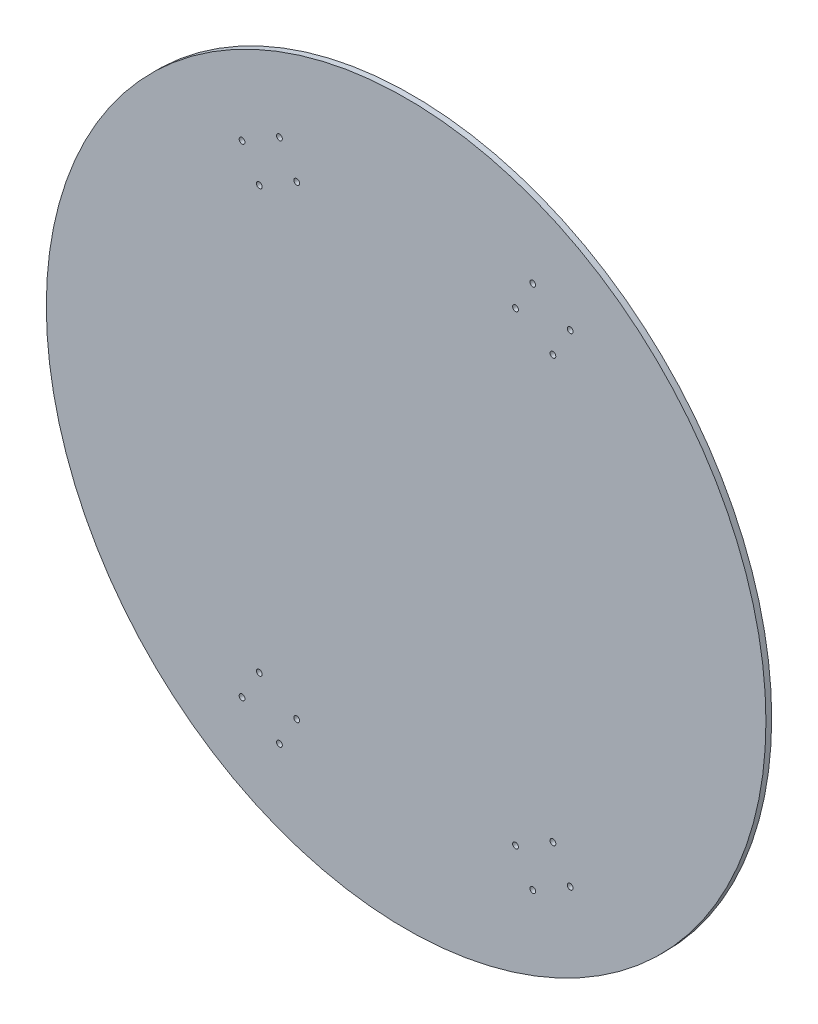
ISO-10303-21;
HEADER;
FILE_DESCRIPTION(('STEP AP214'),'2;1');
FILE_NAME('part.step','',(''),(''),'','','');
FILE_SCHEMA(('AUTOMOTIVE_DESIGN { 1 0 10303 214 1 1 1 1 }'));
ENDSEC;
DATA;
#1=APPLICATION_CONTEXT('core data for automotive mechanical design processes');
#2=APPLICATION_PROTOCOL_DEFINITION('international standard','automotive_design',2000,#1);
#3=PRODUCT_CONTEXT('',#1,'mechanical');
#4=PRODUCT('Part','Part','',(#3));
#5=PRODUCT_RELATED_PRODUCT_CATEGORY('part','',(#4));
#6=PRODUCT_DEFINITION_FORMATION('','',#4);
#7=PRODUCT_DEFINITION_CONTEXT('part definition',#1,'design');
#8=PRODUCT_DEFINITION('design','',#6,#7);
#9=PRODUCT_DEFINITION_SHAPE('','',#8);
#10=(LENGTH_UNIT() NAMED_UNIT(*) SI_UNIT(.MILLI.,.METRE.));
#11=(NAMED_UNIT(*) PLANE_ANGLE_UNIT() SI_UNIT($,.RADIAN.));
#12=(NAMED_UNIT(*) SI_UNIT($,.STERADIAN.) SOLID_ANGLE_UNIT());
#13=UNCERTAINTY_MEASURE_WITH_UNIT(LENGTH_MEASURE(1.E-05),#10,'distance_accuracy_value','');
#14=(GEOMETRIC_REPRESENTATION_CONTEXT(3) GLOBAL_UNCERTAINTY_ASSIGNED_CONTEXT((#13)) GLOBAL_UNIT_ASSIGNED_CONTEXT((#10,
#11,#12)) REPRESENTATION_CONTEXT('',''));
#15=CARTESIAN_POINT('',(0.,0.,0.));
#16=DIRECTION('',(0.,0.,1.));
#17=DIRECTION('',(1.,0.,0.));
#18=AXIS2_PLACEMENT_3D('',#15,#16,#17);
#19=CARTESIAN_POINT('',(0.,0.,4.));
#20=DIRECTION('',(0.,0.,-1.));
#21=DIRECTION('',(-1.,0.,0.));
#22=AXIS2_PLACEMENT_3D('',#19,#20,#21);
#23=CYLINDRICAL_SURFACE('',#22,250.);
#24=CARTESIAN_POINT('',(0.,0.,4.));
#25=DIRECTION('',(0.,0.,1.));
#26=DIRECTION('',(1.,0.,0.));
#27=AXIS2_PLACEMENT_3D('',#24,#25,#26);
#28=CIRCLE('',#27,250.);
#29=CARTESIAN_POINT('',(250.,0.,4.));
#30=VERTEX_POINT('',#29);
#31=EDGE_CURVE('E10',#30,#30,#28,.T.);
#32=ORIENTED_EDGE('',*,*,#31,.F.);
#33=EDGE_LOOP('',(#32));
#34=FACE_BOUND('',#33,.T.);
#35=CARTESIAN_POINT('',(0.,0.,0.));
#36=DIRECTION('',(0.,0.,1.));
#37=DIRECTION('',(1.,0.,0.));
#38=AXIS2_PLACEMENT_3D('',#35,#36,#37);
#39=CIRCLE('',#38,250.);
#40=CARTESIAN_POINT('',(250.,0.,0.));
#41=VERTEX_POINT('',#40);
#42=EDGE_CURVE('E50',#41,#41,#39,.T.);
#43=ORIENTED_EDGE('',*,*,#42,.T.);
#44=EDGE_LOOP('',(#43));
#45=FACE_BOUND('',#44,.T.);
#46=ADVANCED_FACE('F42',(#34,#45),#23,.T.);
#47=CARTESIAN_POINT('',(0.,0.,4.));
#48=DIRECTION('',(0.,0.,1.));
#49=DIRECTION('',(1.,0.,0.));
#50=AXIS2_PLACEMENT_3D('',#47,#48,#49);
#51=PLANE('',#50);
#52=CARTESIAN_POINT('',(101.990381056757,-146.652521873631,4.));
#53=DIRECTION('',(0.,0.,1.));
#54=DIRECTION('',(1.,0.,0.));
#55=AXIS2_PLACEMENT_3D('',#52,#53,#54);
#56=CIRCLE('',#55,2.00000000000259);
#57=CARTESIAN_POINT('',(103.990381056759,-146.652521873631,4.));
#58=VERTEX_POINT('',#57);
#59=EDGE_CURVE('E284',#58,#58,#56,.T.);
#60=ORIENTED_EDGE('',*,*,#59,.F.);
#61=EDGE_LOOP('',(#60));
#62=FACE_BOUND('',#61,.T.);
#63=CARTESIAN_POINT('',(113.990381056749,167.437131564445,4.));
#64=DIRECTION('',(0.,0.,1.));
#65=DIRECTION('',(1.,0.,0.));
#66=AXIS2_PLACEMENT_3D('',#63,#64,#65);
#67=CIRCLE('',#66,1.99999999998204);
#68=CARTESIAN_POINT('',(115.990381056731,167.437131564445,4.));
#69=VERTEX_POINT('',#68);
#70=EDGE_CURVE('E279',#69,#69,#67,.T.);
#71=ORIENTED_EDGE('',*,*,#70,.F.);
#72=EDGE_LOOP('',(#71));
#73=FACE_BOUND('',#72,.T.);
#74=CARTESIAN_POINT('',(101.990381056757,146.652521873631,4.));
#75=DIRECTION('',(0.,0.,1.));
#76=DIRECTION('',(1.,0.,0.));
#77=AXIS2_PLACEMENT_3D('',#74,#75,#76);
#78=CIRCLE('',#77,1.99999999998647);
#79=CARTESIAN_POINT('',(103.990381056743,146.652521873631,4.));
#80=VERTEX_POINT('',#79);
#81=EDGE_CURVE('E283',#80,#80,#78,.T.);
#82=ORIENTED_EDGE('',*,*,#81,.F.);
#83=EDGE_LOOP('',(#82));
#84=FACE_BOUND('',#83,.T.);
#85=CARTESIAN_POINT('',(88.0096189432318,182.437131564436,4.));
#86=DIRECTION('',(0.,0.,1.));
#87=DIRECTION('',(1.,0.,0.));
#88=AXIS2_PLACEMENT_3D('',#85,#86,#87);
#89=CIRCLE('',#88,1.99999999999894);
#90=CARTESIAN_POINT('',(90.0096189432307,182.437131564436,4.));
#91=VERTEX_POINT('',#90);
#92=EDGE_CURVE('E187',#91,#91,#89,.T.);
#93=ORIENTED_EDGE('',*,*,#92,.F.);
#94=EDGE_LOOP('',(#93));
#95=FACE_BOUND('',#94,.T.);
#96=CARTESIAN_POINT('',(-76.0096189432389,-161.652521873622,4.));
#97=DIRECTION('',(0.,0.,1.));
#98=DIRECTION('',(1.,0.,0.));
#99=AXIS2_PLACEMENT_3D('',#96,#97,#98);
#100=CIRCLE('',#99,2.00000000000216);
#101=CARTESIAN_POINT('',(-74.0096189432367,-161.652521873622,4.));
#102=VERTEX_POINT('',#101);
#103=EDGE_CURVE('E267',#102,#102,#100,.T.);
#104=ORIENTED_EDGE('',*,*,#103,.F.);
#105=EDGE_LOOP('',(#104));
#106=FACE_BOUND('',#105,.T.);
#107=CARTESIAN_POINT('',(88.0096189432317,-182.437131564436,4.));
#108=DIRECTION('',(0.,0.,1.));
#109=DIRECTION('',(1.,0.,0.));
#110=AXIS2_PLACEMENT_3D('',#107,#108,#109);
#111=CIRCLE('',#110,1.99999999998116);
#112=CARTESIAN_POINT('',(90.0096189432129,-182.437131564436,4.));
#113=VERTEX_POINT('',#112);
#114=EDGE_CURVE('E293',#113,#113,#111,.T.);
#115=ORIENTED_EDGE('',*,*,#114,.F.);
#116=EDGE_LOOP('',(#115));
#117=FACE_BOUND('',#116,.T.);
#118=CARTESIAN_POINT('',(76.009618943239,-161.652521873622,4.));
#119=DIRECTION('',(0.,0.,1.));
#120=DIRECTION('',(1.,0.,0.));
#121=AXIS2_PLACEMENT_3D('',#118,#119,#120);
#122=CIRCLE('',#121,1.99999999998571);
#123=CARTESIAN_POINT('',(78.0096189432247,-161.652521873622,4.));
#124=VERTEX_POINT('',#123);
#125=EDGE_CURVE('E297',#124,#124,#122,.T.);
#126=ORIENTED_EDGE('',*,*,#125,.F.);
#127=EDGE_LOOP('',(#126));
#128=FACE_BOUND('',#127,.T.);
#129=CARTESIAN_POINT('',(113.990381056749,-167.437131564445,4.));
#130=DIRECTION('',(0.,0.,1.));
#131=DIRECTION('',(1.,0.,0.));
#132=AXIS2_PLACEMENT_3D('',#129,#130,#131);
#133=CIRCLE('',#132,1.99999999999801);
#134=CARTESIAN_POINT('',(115.990381056747,-167.437131564445,4.));
#135=VERTEX_POINT('',#134);
#136=EDGE_CURVE('E287',#135,#135,#133,.T.);
#137=ORIENTED_EDGE('',*,*,#136,.F.);
#138=EDGE_LOOP('',(#137));
#139=FACE_BOUND('',#138,.T.);
#140=CARTESIAN_POINT('',(-101.990381056757,146.652521873631,4.));
#141=DIRECTION('',(0.,0.,1.));
#142=DIRECTION('',(1.,0.,0.));
#143=AXIS2_PLACEMENT_3D('',#140,#141,#142);
#144=CIRCLE('',#143,2.00000000000382);
#145=CARTESIAN_POINT('',(-99.9903810567528,146.652521873631,4.));
#146=VERTEX_POINT('',#145);
#147=EDGE_CURVE('E254',#146,#146,#144,.T.);
#148=ORIENTED_EDGE('',*,*,#147,.F.);
#149=EDGE_LOOP('',(#148));
#150=FACE_BOUND('',#149,.T.);
#151=CARTESIAN_POINT('',(-113.990381056749,-167.437131564445,4.));
#152=DIRECTION('',(0.,0.,1.));
#153=DIRECTION('',(1.,0.,0.));
#154=AXIS2_PLACEMENT_3D('',#151,#152,#153);
#155=CIRCLE('',#154,1.9999999999807);
#156=CARTESIAN_POINT('',(-111.990381056769,-167.437131564445,4.));
#157=VERTEX_POINT('',#156);
#158=EDGE_CURVE('E250',#157,#157,#155,.T.);
#159=ORIENTED_EDGE('',*,*,#158,.F.);
#160=EDGE_LOOP('',(#159));
#161=FACE_BOUND('',#160,.T.);
#162=CARTESIAN_POINT('',(-101.990381056757,-146.652521873631,4.));
#163=DIRECTION('',(0.,0.,1.));
#164=DIRECTION('',(1.,0.,0.));
#165=AXIS2_PLACEMENT_3D('',#162,#163,#164);
#166=CIRCLE('',#165,1.99999999998531);
#167=CARTESIAN_POINT('',(-99.9903810567713,-146.652521873631,4.));
#168=VERTEX_POINT('',#167);
#169=EDGE_CURVE('E253',#168,#168,#166,.T.);
#170=ORIENTED_EDGE('',*,*,#169,.F.);
#171=EDGE_LOOP('',(#170));
#172=FACE_BOUND('',#171,.T.);
#173=CARTESIAN_POINT('',(-88.0096189432317,-182.437131564436,4.));
#174=DIRECTION('',(0.,0.,1.));
#175=DIRECTION('',(1.,0.,0.));
#176=AXIS2_PLACEMENT_3D('',#173,#174,#175);
#177=CIRCLE('',#176,1.99999999999755);
#178=CARTESIAN_POINT('',(-86.0096189432342,-182.437131564436,4.));
#179=VERTEX_POINT('',#178);
#180=EDGE_CURVE('E259',#179,#179,#177,.T.);
#181=ORIENTED_EDGE('',*,*,#180,.F.);
#182=EDGE_LOOP('',(#181));
#183=FACE_BOUND('',#182,.T.);
#184=CARTESIAN_POINT('',(-113.990381056749,167.437131564445,4.));
#185=DIRECTION('',(0.,0.,1.));
#186=DIRECTION('',(1.,0.,0.));
#187=AXIS2_PLACEMENT_3D('',#184,#185,#186);
#188=CIRCLE('',#187,1.99999999999942);
#189=CARTESIAN_POINT('',(-111.99038105675,167.437131564445,4.));
#190=VERTEX_POINT('',#189);
#191=EDGE_CURVE('E262',#190,#190,#188,.T.);
#192=ORIENTED_EDGE('',*,*,#191,.F.);
#193=EDGE_LOOP('',(#192));
#194=FACE_BOUND('',#193,.T.);
#195=CARTESIAN_POINT('',(-76.0096189432389,161.652521873622,4.));
#196=DIRECTION('',(0.,0.,1.));
#197=DIRECTION('',(1.,0.,0.));
#198=AXIS2_PLACEMENT_3D('',#195,#196,#197);
#199=CIRCLE('',#198,1.99999999998688);
#200=CARTESIAN_POINT('',(-74.0096189432521,161.652521873622,4.));
#201=VERTEX_POINT('',#200);
#202=EDGE_CURVE('E272',#201,#201,#199,.T.);
#203=ORIENTED_EDGE('',*,*,#202,.F.);
#204=EDGE_LOOP('',(#203));
#205=FACE_BOUND('',#204,.T.);
#206=CARTESIAN_POINT('',(-88.0096189432317,182.437131564436,4.));
#207=DIRECTION('',(0.,0.,1.));
#208=DIRECTION('',(1.,0.,0.));
#209=AXIS2_PLACEMENT_3D('',#206,#207,#208);
#210=CIRCLE('',#209,1.99999999998249);
#211=CARTESIAN_POINT('',(-86.0096189432492,182.437131564436,4.));
#212=VERTEX_POINT('',#211);
#213=EDGE_CURVE('E276',#212,#212,#210,.T.);
#214=ORIENTED_EDGE('',*,*,#213,.F.);
#215=EDGE_LOOP('',(#214));
#216=FACE_BOUND('',#215,.T.);
#217=CARTESIAN_POINT('',(76.009618943239,161.652521873622,4.));
#218=DIRECTION('',(0.,0.,1.));
#219=DIRECTION('',(1.,0.,0.));
#220=AXIS2_PLACEMENT_3D('',#217,#218,#219);
#221=CIRCLE('',#220,2.00000000000338);
#222=CARTESIAN_POINT('',(78.0096189432423,161.652521873622,4.));
#223=VERTEX_POINT('',#222);
#224=EDGE_CURVE('E58',#223,#223,#221,.T.);
#225=ORIENTED_EDGE('',*,*,#224,.F.);
#226=EDGE_LOOP('',(#225));
#227=FACE_BOUND('',#226,.T.);
#228=ORIENTED_EDGE('',*,*,#31,.T.);
#229=EDGE_LOOP('',(#228));
#230=FACE_BOUND('',#229,.T.);
#231=ADVANCED_FACE('F141',(#62,#73,#84,#95,#106,#117,#128,#139,#150,#161,#172,#183,#194,#205,
#216,#227,#230),#51,.T.);
#232=CARTESIAN_POINT('',(0.,0.,0.));
#233=DIRECTION('',(0.,0.,1.));
#234=DIRECTION('',(1.,0.,0.));
#235=AXIS2_PLACEMENT_3D('',#232,#233,#234);
#236=PLANE('',#235);
#237=CARTESIAN_POINT('',(101.990381056757,-146.652521873631,0.));
#238=DIRECTION('',(0.,0.,1.));
#239=DIRECTION('',(1.,0.,0.));
#240=AXIS2_PLACEMENT_3D('',#237,#238,#239);
#241=CIRCLE('',#240,2.00000000000259);
#242=CARTESIAN_POINT('',(103.990381056759,-146.652521873631,0.));
#243=VERTEX_POINT('',#242);
#244=EDGE_CURVE('E45',#243,#243,#241,.T.);
#245=ORIENTED_EDGE('',*,*,#244,.T.);
#246=EDGE_LOOP('',(#245));
#247=FACE_BOUND('',#246,.T.);
#248=CARTESIAN_POINT('',(113.990381056749,167.437131564445,0.));
#249=DIRECTION('',(0.,0.,1.));
#250=DIRECTION('',(1.,0.,0.));
#251=AXIS2_PLACEMENT_3D('',#248,#249,#250);
#252=CIRCLE('',#251,1.99999999998204);
#253=CARTESIAN_POINT('',(115.990381056731,167.437131564445,0.));
#254=VERTEX_POINT('',#253);
#255=EDGE_CURVE('E116',#254,#254,#252,.T.);
#256=ORIENTED_EDGE('',*,*,#255,.T.);
#257=EDGE_LOOP('',(#256));
#258=FACE_BOUND('',#257,.T.);
#259=CARTESIAN_POINT('',(101.990381056757,146.652521873631,0.));
#260=DIRECTION('',(0.,0.,1.));
#261=DIRECTION('',(1.,0.,0.));
#262=AXIS2_PLACEMENT_3D('',#259,#260,#261);
#263=CIRCLE('',#262,1.99999999998647);
#264=CARTESIAN_POINT('',(103.990381056743,146.652521873631,0.));
#265=VERTEX_POINT('',#264);
#266=EDGE_CURVE('E113',#265,#265,#263,.T.);
#267=ORIENTED_EDGE('',*,*,#266,.T.);
#268=EDGE_LOOP('',(#267));
#269=FACE_BOUND('',#268,.T.);
#270=CARTESIAN_POINT('',(88.0096189432318,182.437131564436,0.));
#271=DIRECTION('',(0.,0.,1.));
#272=DIRECTION('',(1.,0.,0.));
#273=AXIS2_PLACEMENT_3D('',#270,#271,#272);
#274=CIRCLE('',#273,1.99999999999894);
#275=CARTESIAN_POINT('',(90.0096189432307,182.437131564436,0.));
#276=VERTEX_POINT('',#275);
#277=EDGE_CURVE('E109',#276,#276,#274,.T.);
#278=ORIENTED_EDGE('',*,*,#277,.T.);
#279=EDGE_LOOP('',(#278));
#280=FACE_BOUND('',#279,.T.);
#281=CARTESIAN_POINT('',(-76.0096189432389,-161.652521873622,0.));
#282=DIRECTION('',(0.,0.,1.));
#283=DIRECTION('',(1.,0.,0.));
#284=AXIS2_PLACEMENT_3D('',#281,#282,#283);
#285=CIRCLE('',#284,2.00000000000216);
#286=CARTESIAN_POINT('',(-74.0096189432367,-161.652521873622,0.));
#287=VERTEX_POINT('',#286);
#288=EDGE_CURVE('E105',#287,#287,#285,.T.);
#289=ORIENTED_EDGE('',*,*,#288,.T.);
#290=EDGE_LOOP('',(#289));
#291=FACE_BOUND('',#290,.T.);
#292=CARTESIAN_POINT('',(88.0096189432317,-182.437131564436,0.));
#293=DIRECTION('',(0.,0.,1.));
#294=DIRECTION('',(1.,0.,0.));
#295=AXIS2_PLACEMENT_3D('',#292,#293,#294);
#296=CIRCLE('',#295,1.99999999998116);
#297=CARTESIAN_POINT('',(90.0096189432129,-182.437131564436,0.));
#298=VERTEX_POINT('',#297);
#299=EDGE_CURVE('E101',#298,#298,#296,.T.);
#300=ORIENTED_EDGE('',*,*,#299,.T.);
#301=EDGE_LOOP('',(#300));
#302=FACE_BOUND('',#301,.T.);
#303=CARTESIAN_POINT('',(76.009618943239,-161.652521873622,0.));
#304=DIRECTION('',(0.,0.,1.));
#305=DIRECTION('',(1.,0.,0.));
#306=AXIS2_PLACEMENT_3D('',#303,#304,#305);
#307=CIRCLE('',#306,1.99999999998571);
#308=CARTESIAN_POINT('',(78.0096189432247,-161.652521873622,0.));
#309=VERTEX_POINT('',#308);
#310=EDGE_CURVE('E97',#309,#309,#307,.T.);
#311=ORIENTED_EDGE('',*,*,#310,.T.);
#312=EDGE_LOOP('',(#311));
#313=FACE_BOUND('',#312,.T.);
#314=CARTESIAN_POINT('',(113.990381056749,-167.437131564445,0.));
#315=DIRECTION('',(0.,0.,1.));
#316=DIRECTION('',(1.,0.,0.));
#317=AXIS2_PLACEMENT_3D('',#314,#315,#316);
#318=CIRCLE('',#317,1.99999999999801);
#319=CARTESIAN_POINT('',(115.990381056747,-167.437131564445,0.));
#320=VERTEX_POINT('',#319);
#321=EDGE_CURVE('E93',#320,#320,#318,.T.);
#322=ORIENTED_EDGE('',*,*,#321,.T.);
#323=EDGE_LOOP('',(#322));
#324=FACE_BOUND('',#323,.T.);
#325=CARTESIAN_POINT('',(-101.990381056757,146.652521873631,0.));
#326=DIRECTION('',(0.,0.,1.));
#327=DIRECTION('',(1.,0.,0.));
#328=AXIS2_PLACEMENT_3D('',#325,#326,#327);
#329=CIRCLE('',#328,2.00000000000382);
#330=CARTESIAN_POINT('',(-99.9903810567528,146.652521873631,0.));
#331=VERTEX_POINT('',#330);
#332=EDGE_CURVE('E89',#331,#331,#329,.T.);
#333=ORIENTED_EDGE('',*,*,#332,.T.);
#334=EDGE_LOOP('',(#333));
#335=FACE_BOUND('',#334,.T.);
#336=CARTESIAN_POINT('',(-113.990381056749,-167.437131564445,0.));
#337=DIRECTION('',(0.,0.,1.));
#338=DIRECTION('',(1.,0.,0.));
#339=AXIS2_PLACEMENT_3D('',#336,#337,#338);
#340=CIRCLE('',#339,1.9999999999807);
#341=CARTESIAN_POINT('',(-111.990381056769,-167.437131564445,0.));
#342=VERTEX_POINT('',#341);
#343=EDGE_CURVE('E85',#342,#342,#340,.T.);
#344=ORIENTED_EDGE('',*,*,#343,.T.);
#345=EDGE_LOOP('',(#344));
#346=FACE_BOUND('',#345,.T.);
#347=CARTESIAN_POINT('',(-101.990381056757,-146.652521873631,0.));
#348=DIRECTION('',(0.,0.,1.));
#349=DIRECTION('',(1.,0.,0.));
#350=AXIS2_PLACEMENT_3D('',#347,#348,#349);
#351=CIRCLE('',#350,1.99999999998531);
#352=CARTESIAN_POINT('',(-99.9903810567713,-146.652521873631,0.));
#353=VERTEX_POINT('',#352);
#354=EDGE_CURVE('E81',#353,#353,#351,.T.);
#355=ORIENTED_EDGE('',*,*,#354,.T.);
#356=EDGE_LOOP('',(#355));
#357=FACE_BOUND('',#356,.T.);
#358=CARTESIAN_POINT('',(-88.0096189432317,-182.437131564436,0.));
#359=DIRECTION('',(0.,0.,1.));
#360=DIRECTION('',(1.,0.,0.));
#361=AXIS2_PLACEMENT_3D('',#358,#359,#360);
#362=CIRCLE('',#361,1.99999999999755);
#363=CARTESIAN_POINT('',(-86.0096189432342,-182.437131564436,0.));
#364=VERTEX_POINT('',#363);
#365=EDGE_CURVE('E77',#364,#364,#362,.T.);
#366=ORIENTED_EDGE('',*,*,#365,.T.);
#367=EDGE_LOOP('',(#366));
#368=FACE_BOUND('',#367,.T.);
#369=CARTESIAN_POINT('',(-113.990381056749,167.437131564445,0.));
#370=DIRECTION('',(0.,0.,1.));
#371=DIRECTION('',(1.,0.,0.));
#372=AXIS2_PLACEMENT_3D('',#369,#370,#371);
#373=CIRCLE('',#372,1.99999999999942);
#374=CARTESIAN_POINT('',(-111.99038105675,167.437131564445,0.));
#375=VERTEX_POINT('',#374);
#376=EDGE_CURVE('E73',#375,#375,#373,.T.);
#377=ORIENTED_EDGE('',*,*,#376,.T.);
#378=EDGE_LOOP('',(#377));
#379=FACE_BOUND('',#378,.T.);
#380=CARTESIAN_POINT('',(-76.0096189432389,161.652521873622,0.));
#381=DIRECTION('',(0.,0.,1.));
#382=DIRECTION('',(1.,0.,0.));
#383=AXIS2_PLACEMENT_3D('',#380,#381,#382);
#384=CIRCLE('',#383,1.99999999998688);
#385=CARTESIAN_POINT('',(-74.0096189432521,161.652521873622,0.));
#386=VERTEX_POINT('',#385);
#387=EDGE_CURVE('E69',#386,#386,#384,.T.);
#388=ORIENTED_EDGE('',*,*,#387,.T.);
#389=EDGE_LOOP('',(#388));
#390=FACE_BOUND('',#389,.T.);
#391=CARTESIAN_POINT('',(-88.0096189432317,182.437131564436,0.));
#392=DIRECTION('',(0.,0.,1.));
#393=DIRECTION('',(1.,0.,0.));
#394=AXIS2_PLACEMENT_3D('',#391,#392,#393);
#395=CIRCLE('',#394,1.99999999998249);
#396=CARTESIAN_POINT('',(-86.0096189432492,182.437131564436,0.));
#397=VERTEX_POINT('',#396);
#398=EDGE_CURVE('E65',#397,#397,#395,.T.);
#399=ORIENTED_EDGE('',*,*,#398,.T.);
#400=EDGE_LOOP('',(#399));
#401=FACE_BOUND('',#400,.T.);
#402=CARTESIAN_POINT('',(76.009618943239,161.652521873622,0.));
#403=DIRECTION('',(0.,0.,1.));
#404=DIRECTION('',(1.,0.,0.));
#405=AXIS2_PLACEMENT_3D('',#402,#403,#404);
#406=CIRCLE('',#405,2.00000000000338);
#407=CARTESIAN_POINT('',(78.0096189432423,161.652521873622,0.));
#408=VERTEX_POINT('',#407);
#409=EDGE_CURVE('E61',#408,#408,#406,.T.);
#410=ORIENTED_EDGE('',*,*,#409,.T.);
#411=EDGE_LOOP('',(#410));
#412=FACE_BOUND('',#411,.T.);
#413=ORIENTED_EDGE('',*,*,#42,.F.);
#414=EDGE_LOOP('',(#413));
#415=FACE_BOUND('',#414,.T.);
#416=ADVANCED_FACE('F125',(#247,#258,#269,#280,#291,#302,#313,#324,#335,#346,#357,#368,#379,
#390,#401,#412,#415),#236,.F.);
#417=CARTESIAN_POINT('',(76.009618943239,161.652521873622,-6.));
#418=DIRECTION('',(0.,0.,1.));
#419=DIRECTION('',(1.,0.,0.));
#420=AXIS2_PLACEMENT_3D('',#417,#418,#419);
#421=CYLINDRICAL_SURFACE('',#420,2.00000000000338);
#422=ORIENTED_EDGE('',*,*,#224,.T.);
#423=EDGE_LOOP('',(#422));
#424=FACE_BOUND('',#423,.T.);
#425=ORIENTED_EDGE('',*,*,#409,.F.);
#426=EDGE_LOOP('',(#425));
#427=FACE_BOUND('',#426,.T.);
#428=ADVANCED_FACE('F152',(#424,#427),#421,.F.);
#429=CARTESIAN_POINT('',(-88.0096189432317,182.437131564436,-6.));
#430=DIRECTION('',(0.,0.,1.));
#431=DIRECTION('',(1.,0.,0.));
#432=AXIS2_PLACEMENT_3D('',#429,#430,#431);
#433=CYLINDRICAL_SURFACE('',#432,1.99999999998249);
#434=ORIENTED_EDGE('',*,*,#213,.T.);
#435=EDGE_LOOP('',(#434));
#436=FACE_BOUND('',#435,.T.);
#437=ORIENTED_EDGE('',*,*,#398,.F.);
#438=EDGE_LOOP('',(#437));
#439=FACE_BOUND('',#438,.T.);
#440=ADVANCED_FACE('F156',(#436,#439),#433,.F.);
#441=CARTESIAN_POINT('',(-76.0096189432389,161.652521873622,-6.));
#442=DIRECTION('',(0.,0.,1.));
#443=DIRECTION('',(1.,0.,0.));
#444=AXIS2_PLACEMENT_3D('',#441,#442,#443);
#445=CYLINDRICAL_SURFACE('',#444,1.99999999998688);
#446=ORIENTED_EDGE('',*,*,#202,.T.);
#447=EDGE_LOOP('',(#446));
#448=FACE_BOUND('',#447,.T.);
#449=ORIENTED_EDGE('',*,*,#387,.F.);
#450=EDGE_LOOP('',(#449));
#451=FACE_BOUND('',#450,.T.);
#452=ADVANCED_FACE('F217',(#448,#451),#445,.F.);
#453=CARTESIAN_POINT('',(-113.990381056749,167.437131564445,-6.));
#454=DIRECTION('',(0.,0.,1.));
#455=DIRECTION('',(1.,0.,0.));
#456=AXIS2_PLACEMENT_3D('',#453,#454,#455);
#457=CYLINDRICAL_SURFACE('',#456,1.99999999999942);
#458=ORIENTED_EDGE('',*,*,#191,.T.);
#459=EDGE_LOOP('',(#458));
#460=FACE_BOUND('',#459,.T.);
#461=ORIENTED_EDGE('',*,*,#376,.F.);
#462=EDGE_LOOP('',(#461));
#463=FACE_BOUND('',#462,.T.);
#464=ADVANCED_FACE('F223',(#460,#463),#457,.F.);
#465=CARTESIAN_POINT('',(-88.0096189432317,-182.437131564436,-6.));
#466=DIRECTION('',(0.,0.,1.));
#467=DIRECTION('',(1.,0.,0.));
#468=AXIS2_PLACEMENT_3D('',#465,#466,#467);
#469=CYLINDRICAL_SURFACE('',#468,1.99999999999755);
#470=ORIENTED_EDGE('',*,*,#180,.T.);
#471=EDGE_LOOP('',(#470));
#472=FACE_BOUND('',#471,.T.);
#473=ORIENTED_EDGE('',*,*,#365,.F.);
#474=EDGE_LOOP('',(#473));
#475=FACE_BOUND('',#474,.T.);
#476=ADVANCED_FACE('F230',(#472,#475),#469,.F.);
#477=CARTESIAN_POINT('',(-101.990381056757,-146.652521873631,-6.));
#478=DIRECTION('',(0.,0.,1.));
#479=DIRECTION('',(1.,0.,0.));
#480=AXIS2_PLACEMENT_3D('',#477,#478,#479);
#481=CYLINDRICAL_SURFACE('',#480,1.99999999998531);
#482=ORIENTED_EDGE('',*,*,#169,.T.);
#483=EDGE_LOOP('',(#482));
#484=FACE_BOUND('',#483,.T.);
#485=ORIENTED_EDGE('',*,*,#354,.F.);
#486=EDGE_LOOP('',(#485));
#487=FACE_BOUND('',#486,.T.);
#488=ADVANCED_FACE('F232',(#484,#487),#481,.F.);
#489=CARTESIAN_POINT('',(-113.990381056749,-167.437131564445,-6.));
#490=DIRECTION('',(0.,0.,1.));
#491=DIRECTION('',(1.,0.,0.));
#492=AXIS2_PLACEMENT_3D('',#489,#490,#491);
#493=CYLINDRICAL_SURFACE('',#492,1.9999999999807);
#494=ORIENTED_EDGE('',*,*,#158,.T.);
#495=EDGE_LOOP('',(#494));
#496=FACE_BOUND('',#495,.T.);
#497=ORIENTED_EDGE('',*,*,#343,.F.);
#498=EDGE_LOOP('',(#497));
#499=FACE_BOUND('',#498,.T.);
#500=ADVANCED_FACE('F235',(#496,#499),#493,.F.);
#501=CARTESIAN_POINT('',(-101.990381056757,146.652521873631,-6.));
#502=DIRECTION('',(0.,0.,1.));
#503=DIRECTION('',(1.,0.,0.));
#504=AXIS2_PLACEMENT_3D('',#501,#502,#503);
#505=CYLINDRICAL_SURFACE('',#504,2.00000000000382);
#506=ORIENTED_EDGE('',*,*,#147,.T.);
#507=EDGE_LOOP('',(#506));
#508=FACE_BOUND('',#507,.T.);
#509=ORIENTED_EDGE('',*,*,#332,.F.);
#510=EDGE_LOOP('',(#509));
#511=FACE_BOUND('',#510,.T.);
#512=ADVANCED_FACE('F168',(#508,#511),#505,.F.);
#513=CARTESIAN_POINT('',(113.990381056749,-167.437131564445,-6.));
#514=DIRECTION('',(0.,0.,1.));
#515=DIRECTION('',(1.,0.,0.));
#516=AXIS2_PLACEMENT_3D('',#513,#514,#515);
#517=CYLINDRICAL_SURFACE('',#516,1.99999999999801);
#518=ORIENTED_EDGE('',*,*,#136,.T.);
#519=EDGE_LOOP('',(#518));
#520=FACE_BOUND('',#519,.T.);
#521=ORIENTED_EDGE('',*,*,#321,.F.);
#522=EDGE_LOOP('',(#521));
#523=FACE_BOUND('',#522,.T.);
#524=ADVANCED_FACE('F164',(#520,#523),#517,.F.);
#525=CARTESIAN_POINT('',(76.009618943239,-161.652521873622,-6.));
#526=DIRECTION('',(0.,0.,1.));
#527=DIRECTION('',(1.,0.,0.));
#528=AXIS2_PLACEMENT_3D('',#525,#526,#527);
#529=CYLINDRICAL_SURFACE('',#528,1.99999999998571);
#530=ORIENTED_EDGE('',*,*,#125,.T.);
#531=EDGE_LOOP('',(#530));
#532=FACE_BOUND('',#531,.T.);
#533=ORIENTED_EDGE('',*,*,#310,.F.);
#534=EDGE_LOOP('',(#533));
#535=FACE_BOUND('',#534,.T.);
#536=ADVANCED_FACE('F160',(#532,#535),#529,.F.);
#537=CARTESIAN_POINT('',(88.0096189432317,-182.437131564436,-6.));
#538=DIRECTION('',(0.,0.,1.));
#539=DIRECTION('',(1.,0.,0.));
#540=AXIS2_PLACEMENT_3D('',#537,#538,#539);
#541=CYLINDRICAL_SURFACE('',#540,1.99999999998116);
#542=ORIENTED_EDGE('',*,*,#114,.T.);
#543=EDGE_LOOP('',(#542));
#544=FACE_BOUND('',#543,.T.);
#545=ORIENTED_EDGE('',*,*,#299,.F.);
#546=EDGE_LOOP('',(#545));
#547=FACE_BOUND('',#546,.T.);
#548=ADVANCED_FACE('F163',(#544,#547),#541,.F.);
#549=CARTESIAN_POINT('',(-76.0096189432389,-161.652521873622,-6.));
#550=DIRECTION('',(0.,0.,1.));
#551=DIRECTION('',(1.,0.,0.));
#552=AXIS2_PLACEMENT_3D('',#549,#550,#551);
#553=CYLINDRICAL_SURFACE('',#552,2.00000000000216);
#554=ORIENTED_EDGE('',*,*,#103,.T.);
#555=EDGE_LOOP('',(#554));
#556=FACE_BOUND('',#555,.T.);
#557=ORIENTED_EDGE('',*,*,#288,.F.);
#558=EDGE_LOOP('',(#557));
#559=FACE_BOUND('',#558,.T.);
#560=ADVANCED_FACE('F170',(#556,#559),#553,.F.);
#561=CARTESIAN_POINT('',(88.0096189432318,182.437131564436,-6.));
#562=DIRECTION('',(0.,0.,1.));
#563=DIRECTION('',(1.,0.,0.));
#564=AXIS2_PLACEMENT_3D('',#561,#562,#563);
#565=CYLINDRICAL_SURFACE('',#564,1.99999999999894);
#566=ORIENTED_EDGE('',*,*,#92,.T.);
#567=EDGE_LOOP('',(#566));
#568=FACE_BOUND('',#567,.T.);
#569=ORIENTED_EDGE('',*,*,#277,.F.);
#570=EDGE_LOOP('',(#569));
#571=FACE_BOUND('',#570,.T.);
#572=ADVANCED_FACE('F173',(#568,#571),#565,.F.);
#573=CARTESIAN_POINT('',(101.990381056757,146.652521873631,-6.));
#574=DIRECTION('',(0.,0.,1.));
#575=DIRECTION('',(1.,0.,0.));
#576=AXIS2_PLACEMENT_3D('',#573,#574,#575);
#577=CYLINDRICAL_SURFACE('',#576,1.99999999998647);
#578=ORIENTED_EDGE('',*,*,#81,.T.);
#579=EDGE_LOOP('',(#578));
#580=FACE_BOUND('',#579,.T.);
#581=ORIENTED_EDGE('',*,*,#266,.F.);
#582=EDGE_LOOP('',(#581));
#583=FACE_BOUND('',#582,.T.);
#584=ADVANCED_FACE('F135',(#580,#583),#577,.F.);
#585=CARTESIAN_POINT('',(113.990381056749,167.437131564445,-6.));
#586=DIRECTION('',(0.,0.,1.));
#587=DIRECTION('',(1.,0.,0.));
#588=AXIS2_PLACEMENT_3D('',#585,#586,#587);
#589=CYLINDRICAL_SURFACE('',#588,1.99999999998204);
#590=ORIENTED_EDGE('',*,*,#70,.T.);
#591=EDGE_LOOP('',(#590));
#592=FACE_BOUND('',#591,.T.);
#593=ORIENTED_EDGE('',*,*,#255,.F.);
#594=EDGE_LOOP('',(#593));
#595=FACE_BOUND('',#594,.T.);
#596=ADVANCED_FACE('F129',(#592,#595),#589,.F.);
#597=CARTESIAN_POINT('',(101.990381056757,-146.652521873631,-6.));
#598=DIRECTION('',(0.,0.,1.));
#599=DIRECTION('',(1.,0.,0.));
#600=AXIS2_PLACEMENT_3D('',#597,#598,#599);
#601=CYLINDRICAL_SURFACE('',#600,2.00000000000259);
#602=ORIENTED_EDGE('',*,*,#59,.T.);
#603=EDGE_LOOP('',(#602));
#604=FACE_BOUND('',#603,.T.);
#605=ORIENTED_EDGE('',*,*,#244,.F.);
#606=EDGE_LOOP('',(#605));
#607=FACE_BOUND('',#606,.T.);
#608=ADVANCED_FACE('F127',(#604,#607),#601,.F.);
#609=CLOSED_SHELL('',(#46,#231,#416,#428,#440,#452,#464,#476,#488,#500,#512,#524,#536,#548,#560,
#572,#584,#596,#608));
#610=MANIFOLD_SOLID_BREP('B2',#609);
#611=ADVANCED_BREP_SHAPE_REPRESENTATION('',(#18,#610),#14);
#612=SHAPE_DEFINITION_REPRESENTATION(#9,#611);
ENDSEC;
END-ISO-10303-21;
